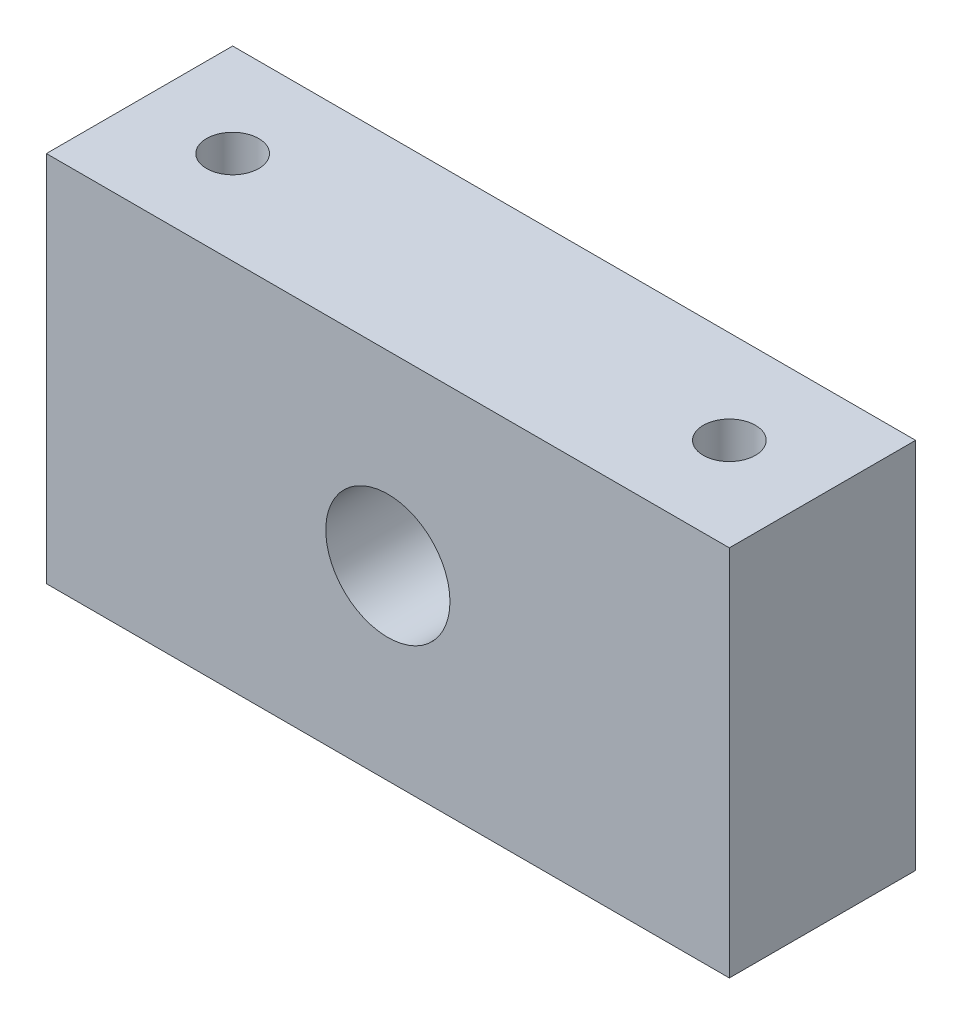
ISO-10303-21;
HEADER;
FILE_DESCRIPTION(('STEP AP214'),'2;1');
FILE_NAME('part.step','',(''),(''),'','','');
FILE_SCHEMA(('AUTOMOTIVE_DESIGN { 1 0 10303 214 1 1 1 1 }'));
ENDSEC;
DATA;
#1=APPLICATION_CONTEXT('core data for automotive mechanical design processes');
#2=APPLICATION_PROTOCOL_DEFINITION('international standard','automotive_design',2000,#1);
#3=PRODUCT_CONTEXT('',#1,'mechanical');
#4=PRODUCT('Part','Part','',(#3));
#5=PRODUCT_RELATED_PRODUCT_CATEGORY('part','',(#4));
#6=PRODUCT_DEFINITION_FORMATION('','',#4);
#7=PRODUCT_DEFINITION_CONTEXT('part definition',#1,'design');
#8=PRODUCT_DEFINITION('design','',#6,#7);
#9=PRODUCT_DEFINITION_SHAPE('','',#8);
#10=(LENGTH_UNIT() NAMED_UNIT(*) SI_UNIT(.MILLI.,.METRE.));
#11=(NAMED_UNIT(*) PLANE_ANGLE_UNIT() SI_UNIT($,.RADIAN.));
#12=(NAMED_UNIT(*) SI_UNIT($,.STERADIAN.) SOLID_ANGLE_UNIT());
#13=UNCERTAINTY_MEASURE_WITH_UNIT(LENGTH_MEASURE(1.E-05),#10,'distance_accuracy_value','');
#14=(GEOMETRIC_REPRESENTATION_CONTEXT(3) GLOBAL_UNCERTAINTY_ASSIGNED_CONTEXT((#13)) GLOBAL_UNIT_ASSIGNED_CONTEXT((#10,
#11,#12)) REPRESENTATION_CONTEXT('',''));
#15=CARTESIAN_POINT('',(0.,0.,0.));
#16=DIRECTION('',(0.,0.,1.));
#17=DIRECTION('',(1.,0.,0.));
#18=AXIS2_PLACEMENT_3D('',#15,#16,#17);
#19=CARTESIAN_POINT('',(27.5,15.,-7.5));
#20=DIRECTION('',(-1.,0.,0.));
#21=DIRECTION('',(0.,0.,1.));
#22=AXIS2_PLACEMENT_3D('',#19,#20,#21);
#23=PLANE('',#22);
#24=DIRECTION('',(0.,0.,-1.));
#25=VECTOR('',#24,1.);
#26=CARTESIAN_POINT('',(27.5,-15.,-7.5));
#27=LINE('',#26,#25);
#28=CARTESIAN_POINT('',(27.5,-15.,7.5));
#29=VERTEX_POINT('',#28);
#30=CARTESIAN_POINT('',(27.5,-15.,-7.5));
#31=VERTEX_POINT('',#30);
#32=EDGE_CURVE('E128',#29,#31,#27,.T.);
#33=ORIENTED_EDGE('',*,*,#32,.T.);
#34=DIRECTION('',(0.,-1.,0.));
#35=VECTOR('',#34,1.);
#36=CARTESIAN_POINT('',(27.5,15.,-7.5));
#37=LINE('',#36,#35);
#38=CARTESIAN_POINT('',(27.5,15.,-7.5));
#39=VERTEX_POINT('',#38);
#40=EDGE_CURVE('E11',#39,#31,#37,.T.);
#41=ORIENTED_EDGE('',*,*,#40,.F.);
#42=DIRECTION('',(0.,0.,-1.));
#43=VECTOR('',#42,1.);
#44=CARTESIAN_POINT('',(27.5,15.,-7.5));
#45=LINE('',#44,#43);
#46=CARTESIAN_POINT('',(27.5,15.,7.5));
#47=VERTEX_POINT('',#46);
#48=EDGE_CURVE('E132',#47,#39,#45,.T.);
#49=ORIENTED_EDGE('',*,*,#48,.F.);
#50=DIRECTION('',(0.,-1.,0.));
#51=VECTOR('',#50,1.);
#52=CARTESIAN_POINT('',(27.5,15.,7.5));
#53=LINE('',#52,#51);
#54=EDGE_CURVE('E142',#47,#29,#53,.T.);
#55=ORIENTED_EDGE('',*,*,#54,.T.);
#56=EDGE_LOOP('',(#33,#41,#49,#55));
#57=FACE_BOUND('',#56,.T.);
#58=ADVANCED_FACE('F43',(#57),#23,.F.);
#59=CARTESIAN_POINT('',(-27.5,15.,-7.5));
#60=DIRECTION('',(0.,0.,1.));
#61=DIRECTION('',(1.,0.,0.));
#62=AXIS2_PLACEMENT_3D('',#59,#60,#61);
#63=PLANE('',#62);
#64=CARTESIAN_POINT('',(0.,0.,-7.5));
#65=DIRECTION('',(0.,0.,1.));
#66=DIRECTION('',(1.,0.,0.));
#67=AXIS2_PLACEMENT_3D('',#64,#65,#66);
#68=CIRCLE('',#67,5.);
#69=CARTESIAN_POINT('',(5.,0.,-7.5));
#70=VERTEX_POINT('',#69);
#71=EDGE_CURVE('E124',#70,#70,#68,.T.);
#72=ORIENTED_EDGE('',*,*,#71,.T.);
#73=EDGE_LOOP('',(#72));
#74=FACE_BOUND('',#73,.T.);
#75=DIRECTION('',(-1.,0.,0.));
#76=VECTOR('',#75,1.);
#77=CARTESIAN_POINT('',(-27.5,-15.,-7.5));
#78=LINE('',#77,#76);
#79=CARTESIAN_POINT('',(-27.5,-15.,-7.5));
#80=VERTEX_POINT('',#79);
#81=EDGE_CURVE('E146',#31,#80,#78,.T.);
#82=ORIENTED_EDGE('',*,*,#81,.T.);
#83=DIRECTION('',(0.,-1.,0.));
#84=VECTOR('',#83,1.);
#85=CARTESIAN_POINT('',(-27.5,15.,-7.5));
#86=LINE('',#85,#84);
#87=CARTESIAN_POINT('',(-27.5,15.,-7.5));
#88=VERTEX_POINT('',#87);
#89=EDGE_CURVE('E52',#88,#80,#86,.T.);
#90=ORIENTED_EDGE('',*,*,#89,.F.);
#91=DIRECTION('',(-1.,0.,0.));
#92=VECTOR('',#91,1.);
#93=CARTESIAN_POINT('',(-27.5,15.,-7.5));
#94=LINE('',#93,#92);
#95=EDGE_CURVE('E91',#39,#88,#94,.T.);
#96=ORIENTED_EDGE('',*,*,#95,.F.);
#97=ORIENTED_EDGE('',*,*,#40,.T.);
#98=EDGE_LOOP('',(#82,#90,#96,#97));
#99=FACE_BOUND('',#98,.T.);
#100=ADVANCED_FACE('F177',(#74,#99),#63,.F.);
#101=CARTESIAN_POINT('',(-27.5,15.,-7.5));
#102=DIRECTION('',(1.,0.,0.));
#103=DIRECTION('',(0.,0.,-1.));
#104=AXIS2_PLACEMENT_3D('',#101,#102,#103);
#105=PLANE('',#104);
#106=DIRECTION('',(0.,0.,1.));
#107=VECTOR('',#106,1.);
#108=CARTESIAN_POINT('',(-27.5,-15.,-7.5));
#109=LINE('',#108,#107);
#110=CARTESIAN_POINT('',(-27.5,-15.,7.5));
#111=VERTEX_POINT('',#110);
#112=EDGE_CURVE('E78',#80,#111,#109,.T.);
#113=ORIENTED_EDGE('',*,*,#112,.T.);
#114=DIRECTION('',(0.,-1.,0.));
#115=VECTOR('',#114,1.);
#116=CARTESIAN_POINT('',(-27.5,15.,7.5));
#117=LINE('',#116,#115);
#118=CARTESIAN_POINT('',(-27.5,15.,7.5));
#119=VERTEX_POINT('',#118);
#120=EDGE_CURVE('E155',#119,#111,#117,.T.);
#121=ORIENTED_EDGE('',*,*,#120,.F.);
#122=DIRECTION('',(0.,0.,1.));
#123=VECTOR('',#122,1.);
#124=CARTESIAN_POINT('',(-27.5,15.,-7.5));
#125=LINE('',#124,#123);
#126=EDGE_CURVE('E137',#88,#119,#125,.T.);
#127=ORIENTED_EDGE('',*,*,#126,.F.);
#128=ORIENTED_EDGE('',*,*,#89,.T.);
#129=EDGE_LOOP('',(#113,#121,#127,#128));
#130=FACE_BOUND('',#129,.T.);
#131=ADVANCED_FACE('F159',(#130),#105,.F.);
#132=CARTESIAN_POINT('',(-27.5,15.,7.5));
#133=DIRECTION('',(0.,0.,-1.));
#134=DIRECTION('',(-1.,0.,0.));
#135=AXIS2_PLACEMENT_3D('',#132,#133,#134);
#136=PLANE('',#135);
#137=CARTESIAN_POINT('',(0.,0.,7.5));
#138=DIRECTION('',(0.,0.,1.));
#139=DIRECTION('',(1.,0.,0.));
#140=AXIS2_PLACEMENT_3D('',#137,#138,#139);
#141=CIRCLE('',#140,5.);
#142=CARTESIAN_POINT('',(5.,0.,7.5));
#143=VERTEX_POINT('',#142);
#144=EDGE_CURVE('E123',#143,#143,#141,.T.);
#145=ORIENTED_EDGE('',*,*,#144,.F.);
#146=EDGE_LOOP('',(#145));
#147=FACE_BOUND('',#146,.T.);
#148=DIRECTION('',(1.,0.,0.));
#149=VECTOR('',#148,1.);
#150=CARTESIAN_POINT('',(-27.5,-15.,7.5));
#151=LINE('',#150,#149);
#152=EDGE_CURVE('E84',#111,#29,#151,.T.);
#153=ORIENTED_EDGE('',*,*,#152,.T.);
#154=ORIENTED_EDGE('',*,*,#54,.F.);
#155=DIRECTION('',(1.,0.,0.));
#156=VECTOR('',#155,1.);
#157=CARTESIAN_POINT('',(-27.5,15.,7.5));
#158=LINE('',#157,#156);
#159=EDGE_CURVE('E60',#119,#47,#158,.T.);
#160=ORIENTED_EDGE('',*,*,#159,.F.);
#161=ORIENTED_EDGE('',*,*,#120,.T.);
#162=EDGE_LOOP('',(#153,#154,#160,#161));
#163=FACE_BOUND('',#162,.T.);
#164=ADVANCED_FACE('F166',(#147,#163),#136,.F.);
#165=CARTESIAN_POINT('',(0.,15.,0.));
#166=DIRECTION('',(0.,1.,0.));
#167=DIRECTION('',(0.,0.,1.));
#168=AXIS2_PLACEMENT_3D('',#165,#166,#167);
#169=PLANE('',#168);
#170=CARTESIAN_POINT('',(-20.,15.,0.));
#171=DIRECTION('',(0.,1.,0.));
#172=DIRECTION('',(0.,0.,1.));
#173=AXIS2_PLACEMENT_3D('',#170,#171,#172);
#174=CIRCLE('',#173,2.09999999999999);
#175=CARTESIAN_POINT('',(-20.,15.,2.09999999999999));
#176=VERTEX_POINT('',#175);
#177=EDGE_CURVE('E110',#176,#176,#174,.T.);
#178=ORIENTED_EDGE('',*,*,#177,.F.);
#179=EDGE_LOOP('',(#178));
#180=FACE_BOUND('',#179,.T.);
#181=CARTESIAN_POINT('',(20.,15.,0.));
#182=DIRECTION('',(0.,1.,0.));
#183=DIRECTION('',(0.,0.,1.));
#184=AXIS2_PLACEMENT_3D('',#181,#182,#183);
#185=CIRCLE('',#184,2.09999999999999);
#186=CARTESIAN_POINT('',(20.,15.,2.09999999999999));
#187=VERTEX_POINT('',#186);
#188=EDGE_CURVE('E109',#187,#187,#185,.T.);
#189=ORIENTED_EDGE('',*,*,#188,.F.);
#190=EDGE_LOOP('',(#189));
#191=FACE_BOUND('',#190,.T.);
#192=ORIENTED_EDGE('',*,*,#48,.T.);
#193=ORIENTED_EDGE('',*,*,#95,.T.);
#194=ORIENTED_EDGE('',*,*,#126,.T.);
#195=ORIENTED_EDGE('',*,*,#159,.T.);
#196=EDGE_LOOP('',(#192,#193,#194,#195));
#197=FACE_BOUND('',#196,.T.);
#198=ADVANCED_FACE('F168',(#180,#191,#197),#169,.T.);
#199=CARTESIAN_POINT('',(0.,-15.,0.));
#200=DIRECTION('',(0.,1.,0.));
#201=DIRECTION('',(0.,0.,1.));
#202=AXIS2_PLACEMENT_3D('',#199,#200,#201);
#203=PLANE('',#202);
#204=ORIENTED_EDGE('',*,*,#32,.F.);
#205=ORIENTED_EDGE('',*,*,#152,.F.);
#206=ORIENTED_EDGE('',*,*,#112,.F.);
#207=ORIENTED_EDGE('',*,*,#81,.F.);
#208=EDGE_LOOP('',(#204,#205,#206,#207));
#209=FACE_BOUND('',#208,.T.);
#210=ADVANCED_FACE('F162',(#209),#203,.F.);
#211=CARTESIAN_POINT('',(0.,0.,-7.5));
#212=DIRECTION('',(0.,0.,1.));
#213=DIRECTION('',(1.,0.,0.));
#214=AXIS2_PLACEMENT_3D('',#211,#212,#213);
#215=CYLINDRICAL_SURFACE('',#214,5.);
#216=ORIENTED_EDGE('',*,*,#71,.F.);
#217=EDGE_LOOP('',(#216));
#218=FACE_BOUND('',#217,.T.);
#219=ORIENTED_EDGE('',*,*,#144,.T.);
#220=EDGE_LOOP('',(#219));
#221=FACE_BOUND('',#220,.T.);
#222=ADVANCED_FACE('F190',(#218,#221),#215,.F.);
#223=CARTESIAN_POINT('',(20.,-5.,0.));
#224=DIRECTION('',(0.,1.,0.));
#225=DIRECTION('',(0.,0.,1.));
#226=AXIS2_PLACEMENT_3D('',#223,#224,#225);
#227=CONICAL_SURFACE('',#226,2.1,1.02974425867665);
#228=CARTESIAN_POINT('',(20.,-6.26180729995788,0.));
#229=VERTEX_POINT('',#228);
#230=VERTEX_LOOP('',#229);
#231=FACE_BOUND('',#230,.T.);
#232=CARTESIAN_POINT('',(20.,-5.,0.));
#233=DIRECTION('',(0.,1.,0.));
#234=DIRECTION('',(0.,0.,1.));
#235=AXIS2_PLACEMENT_3D('',#232,#233,#234);
#236=CIRCLE('',#235,2.1);
#237=CARTESIAN_POINT('',(20.,-5.,2.1));
#238=VERTEX_POINT('',#237);
#239=EDGE_CURVE('E115',#238,#238,#236,.T.);
#240=ORIENTED_EDGE('',*,*,#239,.T.);
#241=EDGE_LOOP('',(#240));
#242=FACE_BOUND('',#241,.T.);
#243=ADVANCED_FACE('F193',(#231,#242),#227,.F.);
#244=CARTESIAN_POINT('',(20.,15.,0.));
#245=DIRECTION('',(0.,1.,0.));
#246=DIRECTION('',(0.,0.,1.));
#247=AXIS2_PLACEMENT_3D('',#244,#245,#246);
#248=CYLINDRICAL_SURFACE('',#247,2.09999999999999);
#249=ORIENTED_EDGE('',*,*,#239,.F.);
#250=EDGE_LOOP('',(#249));
#251=FACE_BOUND('',#250,.T.);
#252=ORIENTED_EDGE('',*,*,#188,.T.);
#253=EDGE_LOOP('',(#252));
#254=FACE_BOUND('',#253,.T.);
#255=ADVANCED_FACE('F102',(#251,#254),#248,.F.);
#256=CARTESIAN_POINT('',(-20.,-5.,0.));
#257=DIRECTION('',(0.,1.,0.));
#258=DIRECTION('',(0.,0.,1.));
#259=AXIS2_PLACEMENT_3D('',#256,#257,#258);
#260=CONICAL_SURFACE('',#259,2.1,1.02974425867665);
#261=CARTESIAN_POINT('',(-20.,-6.26180729995788,0.));
#262=VERTEX_POINT('',#261);
#263=VERTEX_LOOP('',#262);
#264=FACE_BOUND('',#263,.T.);
#265=CARTESIAN_POINT('',(-20.,-5.,0.));
#266=DIRECTION('',(0.,1.,0.));
#267=DIRECTION('',(0.,0.,1.));
#268=AXIS2_PLACEMENT_3D('',#265,#266,#267);
#269=CIRCLE('',#268,2.1);
#270=CARTESIAN_POINT('',(-20.,-5.,2.1));
#271=VERTEX_POINT('',#270);
#272=EDGE_CURVE('E106',#271,#271,#269,.T.);
#273=ORIENTED_EDGE('',*,*,#272,.T.);
#274=EDGE_LOOP('',(#273));
#275=FACE_BOUND('',#274,.T.);
#276=ADVANCED_FACE('F98',(#264,#275),#260,.F.);
#277=CARTESIAN_POINT('',(-20.,15.,0.));
#278=DIRECTION('',(0.,1.,0.));
#279=DIRECTION('',(0.,0.,1.));
#280=AXIS2_PLACEMENT_3D('',#277,#278,#279);
#281=CYLINDRICAL_SURFACE('',#280,2.09999999999999);
#282=ORIENTED_EDGE('',*,*,#272,.F.);
#283=EDGE_LOOP('',(#282));
#284=FACE_BOUND('',#283,.T.);
#285=ORIENTED_EDGE('',*,*,#177,.T.);
#286=EDGE_LOOP('',(#285));
#287=FACE_BOUND('',#286,.T.);
#288=ADVANCED_FACE('F101',(#284,#287),#281,.F.);
#289=CLOSED_SHELL('',(#58,#100,#131,#164,#198,#210,#222,#243,#255,#276,#288));
#290=MANIFOLD_SOLID_BREP('B2',#289);
#291=ADVANCED_BREP_SHAPE_REPRESENTATION('',(#18,#290),#14);
#292=SHAPE_DEFINITION_REPRESENTATION(#9,#291);
ENDSEC;
END-ISO-10303-21;
